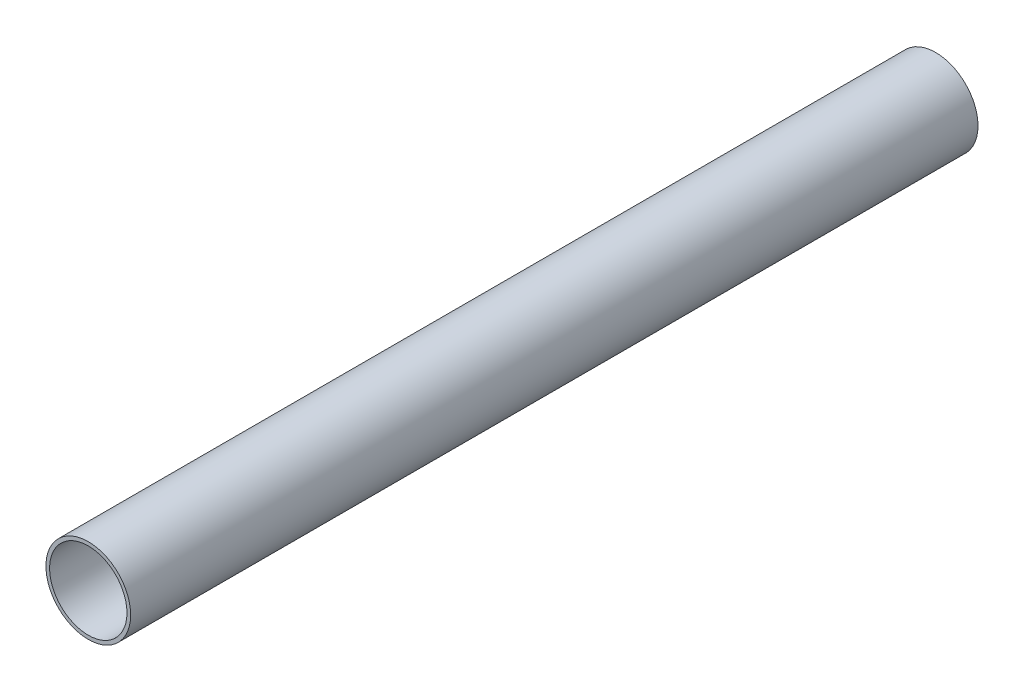
ISO-10303-21;
HEADER;
FILE_DESCRIPTION(('STEP AP214'),'2;1');
FILE_NAME('part.step','',(''),(''),'','','');
FILE_SCHEMA(('AUTOMOTIVE_DESIGN { 1 0 10303 214 1 1 1 1 }'));
ENDSEC;
DATA;
#1=APPLICATION_CONTEXT('core data for automotive mechanical design processes');
#2=APPLICATION_PROTOCOL_DEFINITION('international standard','automotive_design',2000,#1);
#3=PRODUCT_CONTEXT('',#1,'mechanical');
#4=PRODUCT('Part','Part','',(#3));
#5=PRODUCT_RELATED_PRODUCT_CATEGORY('part','',(#4));
#6=PRODUCT_DEFINITION_FORMATION('','',#4);
#7=PRODUCT_DEFINITION_CONTEXT('part definition',#1,'design');
#8=PRODUCT_DEFINITION('design','',#6,#7);
#9=PRODUCT_DEFINITION_SHAPE('','',#8);
#10=(LENGTH_UNIT() NAMED_UNIT(*) SI_UNIT(.MILLI.,.METRE.));
#11=(NAMED_UNIT(*) PLANE_ANGLE_UNIT() SI_UNIT($,.RADIAN.));
#12=(NAMED_UNIT(*) SI_UNIT($,.STERADIAN.) SOLID_ANGLE_UNIT());
#13=UNCERTAINTY_MEASURE_WITH_UNIT(LENGTH_MEASURE(1.E-05),#10,'distance_accuracy_value','');
#14=(GEOMETRIC_REPRESENTATION_CONTEXT(3) GLOBAL_UNCERTAINTY_ASSIGNED_CONTEXT((#13)) GLOBAL_UNIT_ASSIGNED_CONTEXT((#10,
#11,#12)) REPRESENTATION_CONTEXT('',''));
#15=CARTESIAN_POINT('',(0.,0.,0.));
#16=DIRECTION('',(0.,0.,1.));
#17=DIRECTION('',(1.,0.,0.));
#18=AXIS2_PLACEMENT_3D('',#15,#16,#17);
#19=CARTESIAN_POINT('',(0.,0.,230.));
#20=DIRECTION('',(0.,0.,1.));
#21=DIRECTION('',(1.,0.,0.));
#22=AXIS2_PLACEMENT_3D('',#19,#20,#21);
#23=PLANE('',#22);
#24=CARTESIAN_POINT('',(0.,0.,230.));
#25=DIRECTION('',(0.,0.,1.));
#26=DIRECTION('',(1.,0.,0.));
#27=AXIS2_PLACEMENT_3D('',#24,#25,#26);
#28=CIRCLE('',#27,11.5);
#29=CARTESIAN_POINT('',(11.5,0.,230.));
#30=VERTEX_POINT('',#29);
#31=EDGE_CURVE('E10',#30,#30,#28,.T.);
#32=ORIENTED_EDGE('',*,*,#31,.T.);
#33=EDGE_LOOP('',(#32));
#34=FACE_BOUND('',#33,.T.);
#35=CARTESIAN_POINT('',(0.,0.,230.));
#36=DIRECTION('',(0.,0.,1.));
#37=DIRECTION('',(1.,0.,0.));
#38=AXIS2_PLACEMENT_3D('',#35,#36,#37);
#39=CIRCLE('',#38,10.5);
#40=CARTESIAN_POINT('',(10.5,0.,230.));
#41=VERTEX_POINT('',#40);
#42=EDGE_CURVE('E54',#41,#41,#39,.T.);
#43=ORIENTED_EDGE('',*,*,#42,.F.);
#44=EDGE_LOOP('',(#43));
#45=FACE_BOUND('',#44,.T.);
#46=ADVANCED_FACE('F41',(#34,#45),#23,.T.);
#47=CARTESIAN_POINT('',(0.,0.,0.));
#48=DIRECTION('',(0.,0.,1.));
#49=DIRECTION('',(1.,0.,0.));
#50=AXIS2_PLACEMENT_3D('',#47,#48,#49);
#51=PLANE('',#50);
#52=CARTESIAN_POINT('',(0.,0.,0.));
#53=DIRECTION('',(0.,0.,1.));
#54=DIRECTION('',(1.,0.,0.));
#55=AXIS2_PLACEMENT_3D('',#52,#53,#54);
#56=CIRCLE('',#55,11.5);
#57=CARTESIAN_POINT('',(11.5,0.,0.));
#58=VERTEX_POINT('',#57);
#59=EDGE_CURVE('E45',#58,#58,#56,.T.);
#60=ORIENTED_EDGE('',*,*,#59,.F.);
#61=EDGE_LOOP('',(#60));
#62=FACE_BOUND('',#61,.T.);
#63=CARTESIAN_POINT('',(0.,0.,0.));
#64=DIRECTION('',(0.,0.,1.));
#65=DIRECTION('',(1.,0.,0.));
#66=AXIS2_PLACEMENT_3D('',#63,#64,#65);
#67=CIRCLE('',#66,10.5);
#68=CARTESIAN_POINT('',(10.5,0.,0.));
#69=VERTEX_POINT('',#68);
#70=EDGE_CURVE('E56',#69,#69,#67,.T.);
#71=ORIENTED_EDGE('',*,*,#70,.T.);
#72=EDGE_LOOP('',(#71));
#73=FACE_BOUND('',#72,.T.);
#74=ADVANCED_FACE('F68',(#62,#73),#51,.F.);
#75=CARTESIAN_POINT('',(0.,0.,230.));
#76=DIRECTION('',(0.,0.,-1.));
#77=DIRECTION('',(-1.,0.,0.));
#78=AXIS2_PLACEMENT_3D('',#75,#76,#77);
#79=CYLINDRICAL_SURFACE('',#78,11.5);
#80=ORIENTED_EDGE('',*,*,#31,.F.);
#81=EDGE_LOOP('',(#80));
#82=FACE_BOUND('',#81,.T.);
#83=ORIENTED_EDGE('',*,*,#59,.T.);
#84=EDGE_LOOP('',(#83));
#85=FACE_BOUND('',#84,.T.);
#86=ADVANCED_FACE('F43',(#82,#85),#79,.T.);
#87=CARTESIAN_POINT('',(0.,0.,230.));
#88=DIRECTION('',(0.,0.,-1.));
#89=DIRECTION('',(-1.,0.,0.));
#90=AXIS2_PLACEMENT_3D('',#87,#88,#89);
#91=CYLINDRICAL_SURFACE('',#90,10.5);
#92=ORIENTED_EDGE('',*,*,#42,.T.);
#93=EDGE_LOOP('',(#92));
#94=FACE_BOUND('',#93,.T.);
#95=ORIENTED_EDGE('',*,*,#70,.F.);
#96=EDGE_LOOP('',(#95));
#97=FACE_BOUND('',#96,.T.);
#98=ADVANCED_FACE('F64',(#94,#97),#91,.F.);
#99=CLOSED_SHELL('',(#46,#74,#86,#98));
#100=MANIFOLD_SOLID_BREP('B2',#99);
#101=ADVANCED_BREP_SHAPE_REPRESENTATION('',(#18,#100),#14);
#102=SHAPE_DEFINITION_REPRESENTATION(#9,#101);
ENDSEC;
END-ISO-10303-21;
